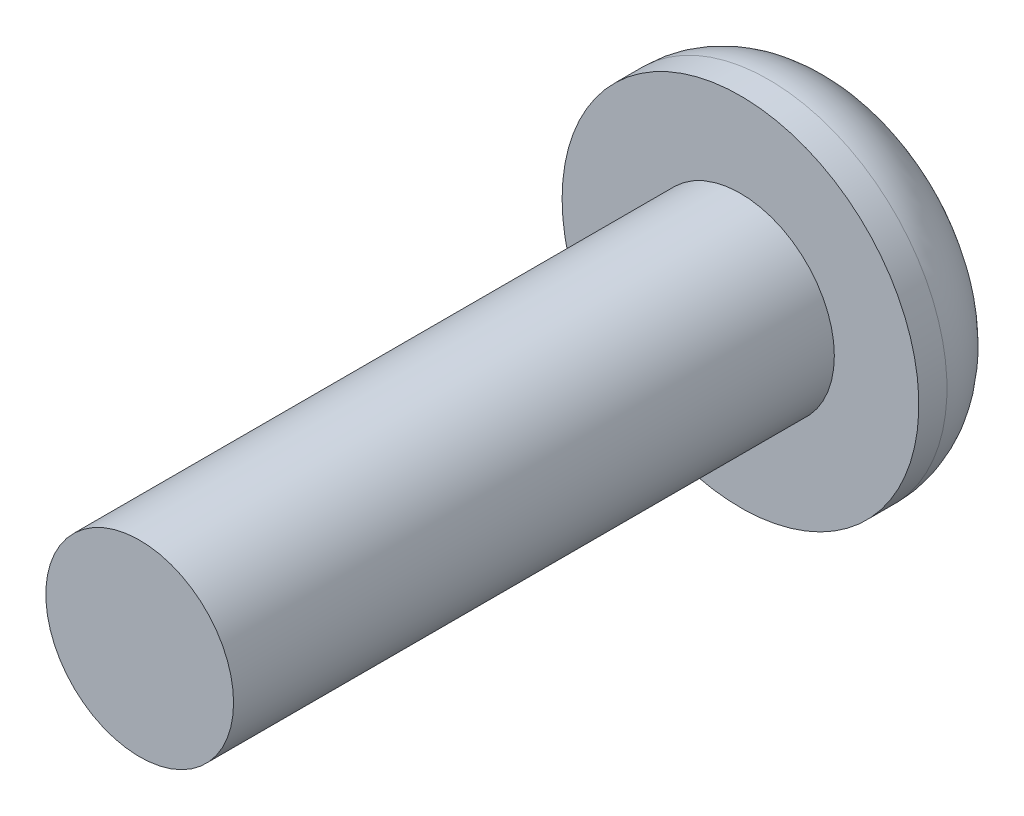
ISO-10303-21;
HEADER;
FILE_DESCRIPTION(('STEP AP214'),'2;1');
FILE_NAME('part.step','',(''),(''),'','','');
FILE_SCHEMA(('AUTOMOTIVE_DESIGN { 1 0 10303 214 1 1 1 1 }'));
ENDSEC;
DATA;
#1=APPLICATION_CONTEXT('core data for automotive mechanical design processes');
#2=APPLICATION_PROTOCOL_DEFINITION('international standard','automotive_design',2000,#1);
#3=PRODUCT_CONTEXT('',#1,'mechanical');
#4=PRODUCT('Part','Part','',(#3));
#5=PRODUCT_RELATED_PRODUCT_CATEGORY('part','',(#4));
#6=PRODUCT_DEFINITION_FORMATION('','',#4);
#7=PRODUCT_DEFINITION_CONTEXT('part definition',#1,'design');
#8=PRODUCT_DEFINITION('design','',#6,#7);
#9=PRODUCT_DEFINITION_SHAPE('','',#8);
#10=(LENGTH_UNIT() NAMED_UNIT(*) SI_UNIT(.MILLI.,.METRE.));
#11=(NAMED_UNIT(*) PLANE_ANGLE_UNIT() SI_UNIT($,.RADIAN.));
#12=(NAMED_UNIT(*) SI_UNIT($,.STERADIAN.) SOLID_ANGLE_UNIT());
#13=UNCERTAINTY_MEASURE_WITH_UNIT(LENGTH_MEASURE(1.E-05),#10,'distance_accuracy_value','');
#14=(GEOMETRIC_REPRESENTATION_CONTEXT(3) GLOBAL_UNCERTAINTY_ASSIGNED_CONTEXT((#13)) GLOBAL_UNIT_ASSIGNED_CONTEXT((#10,
#11,#12)) REPRESENTATION_CONTEXT('',''));
#15=CARTESIAN_POINT('',(0.,0.,0.));
#16=DIRECTION('',(0.,0.,1.));
#17=DIRECTION('',(1.,0.,0.));
#18=AXIS2_PLACEMENT_3D('',#15,#16,#17);
#19=CARTESIAN_POINT('',(0.,0.,16.));
#20=DIRECTION('',(0.,0.,-1.));
#21=DIRECTION('',(-1.,0.,0.));
#22=AXIS2_PLACEMENT_3D('',#19,#20,#21);
#23=CYLINDRICAL_SURFACE('',#22,2.5);
#24=CARTESIAN_POINT('',(0.,0.,16.));
#25=DIRECTION('',(0.,0.,1.));
#26=DIRECTION('',(1.,0.,0.));
#27=AXIS2_PLACEMENT_3D('',#24,#25,#26);
#28=CIRCLE('',#27,2.5);
#29=CARTESIAN_POINT('',(2.5,0.,16.));
#30=VERTEX_POINT('',#29);
#31=EDGE_CURVE('E50',#30,#30,#28,.T.);
#32=ORIENTED_EDGE('',*,*,#31,.F.);
#33=EDGE_LOOP('',(#32));
#34=FACE_BOUND('',#33,.T.);
#35=CARTESIAN_POINT('',(0.,0.,0.));
#36=DIRECTION('',(0.,0.,1.));
#37=DIRECTION('',(1.,0.,0.));
#38=AXIS2_PLACEMENT_3D('',#35,#36,#37);
#39=CIRCLE('',#38,2.5);
#40=CARTESIAN_POINT('',(2.5,0.,0.));
#41=VERTEX_POINT('',#40);
#42=EDGE_CURVE('E55',#41,#41,#39,.T.);
#43=ORIENTED_EDGE('',*,*,#42,.T.);
#44=EDGE_LOOP('',(#43));
#45=FACE_BOUND('',#44,.T.);
#46=ADVANCED_FACE('F37',(#34,#45),#23,.T.);
#47=CARTESIAN_POINT('',(0.,0.,16.));
#48=DIRECTION('',(0.,0.,1.));
#49=DIRECTION('',(1.,0.,0.));
#50=AXIS2_PLACEMENT_3D('',#47,#48,#49);
#51=PLANE('',#50);
#52=ORIENTED_EDGE('',*,*,#31,.T.);
#53=EDGE_LOOP('',(#52));
#54=FACE_BOUND('',#53,.T.);
#55=ADVANCED_FACE('F82',(#54),#51,.T.);
#56=CARTESIAN_POINT('',(0.,0.,-2.75));
#57=DIRECTION('',(0.,0.,1.));
#58=DIRECTION('',(1.,0.,0.));
#59=AXIS2_PLACEMENT_3D('',#56,#57,#58);
#60=CYLINDRICAL_SURFACE('',#59,4.75);
#61=CARTESIAN_POINT('',(0.,0.,-0.75));
#62=DIRECTION('',(0.,0.,-1.));
#63=DIRECTION('',(-1.,0.,0.));
#64=AXIS2_PLACEMENT_3D('',#61,#62,#63);
#65=CIRCLE('',#64,4.75);
#66=CARTESIAN_POINT('',(-4.75,0.,-0.75));
#67=VERTEX_POINT('',#66);
#68=EDGE_CURVE('E10',#67,#67,#65,.F.);
#69=ORIENTED_EDGE('',*,*,#68,.T.);
#70=EDGE_LOOP('',(#69));
#71=FACE_BOUND('',#70,.T.);
#72=CARTESIAN_POINT('',(0.,0.,0.));
#73=DIRECTION('',(0.,0.,-1.));
#74=DIRECTION('',(-1.,0.,0.));
#75=AXIS2_PLACEMENT_3D('',#72,#73,#74);
#76=CIRCLE('',#75,4.75);
#77=CARTESIAN_POINT('',(-4.75,0.,0.));
#78=VERTEX_POINT('',#77);
#79=EDGE_CURVE('E60',#78,#78,#76,.T.);
#80=ORIENTED_EDGE('',*,*,#79,.T.);
#81=EDGE_LOOP('',(#80));
#82=FACE_BOUND('',#81,.T.);
#83=ADVANCED_FACE('F66',(#71,#82),#60,.T.);
#84=CARTESIAN_POINT('',(0.,0.,-2.75));
#85=DIRECTION('',(0.,0.,-1.));
#86=DIRECTION('',(-1.,0.,0.));
#87=AXIS2_PLACEMENT_3D('',#84,#85,#86);
#88=PLANE('',#87);
#89=CARTESIAN_POINT('',(0.,0.,-2.75));
#90=DIRECTION('',(0.,0.,-1.));
#91=DIRECTION('',(-1.,0.,0.));
#92=AXIS2_PLACEMENT_3D('',#89,#90,#91);
#93=CIRCLE('',#92,2.75);
#94=CARTESIAN_POINT('',(-2.75,0.,-2.75));
#95=VERTEX_POINT('',#94);
#96=EDGE_CURVE('E45',#95,#95,#93,.T.);
#97=ORIENTED_EDGE('',*,*,#96,.T.);
#98=EDGE_LOOP('',(#97));
#99=FACE_BOUND('',#98,.T.);
#100=ADVANCED_FACE('F70',(#99),#88,.T.);
#101=CARTESIAN_POINT('',(0.,0.,0.));
#102=DIRECTION('',(0.,0.,-1.));
#103=DIRECTION('',(-1.,0.,0.));
#104=AXIS2_PLACEMENT_3D('',#101,#102,#103);
#105=PLANE('',#104);
#106=ORIENTED_EDGE('',*,*,#42,.F.);
#107=EDGE_LOOP('',(#106));
#108=FACE_BOUND('',#107,.T.);
#109=ORIENTED_EDGE('',*,*,#79,.F.);
#110=EDGE_LOOP('',(#109));
#111=FACE_BOUND('',#110,.T.);
#112=ADVANCED_FACE('F68',(#108,#111),#105,.F.);
#113=CARTESIAN_POINT('',(0.,0.,-0.75));
#114=DIRECTION('',(0.,0.,-1.));
#115=DIRECTION('',(-1.,0.,0.));
#116=AXIS2_PLACEMENT_3D('',#113,#114,#115);
#117=TOROIDAL_SURFACE('',#116,2.75,2.);
#118=ORIENTED_EDGE('',*,*,#68,.F.);
#119=EDGE_LOOP('',(#118));
#120=FACE_BOUND('',#119,.T.);
#121=ORIENTED_EDGE('',*,*,#96,.F.);
#122=EDGE_LOOP('',(#121));
#123=FACE_BOUND('',#122,.T.);
#124=ADVANCED_FACE('F39',(#120,#123),#117,.T.);
#125=CLOSED_SHELL('',(#46,#55,#83,#100,#112,#124));
#126=MANIFOLD_SOLID_BREP('B2',#125);
#127=ADVANCED_BREP_SHAPE_REPRESENTATION('',(#18,#126),#14);
#128=SHAPE_DEFINITION_REPRESENTATION(#9,#127);
ENDSEC;
END-ISO-10303-21;
